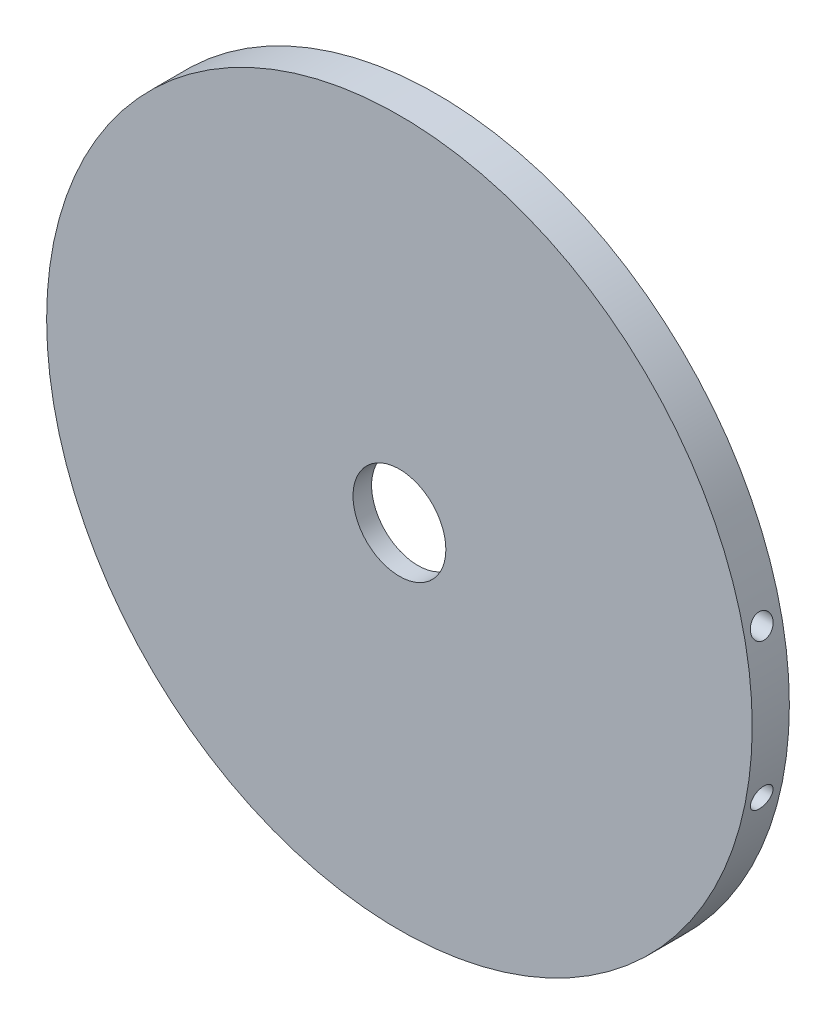
ISO-10303-21;
HEADER;
FILE_DESCRIPTION(('STEP AP214'),'2;1');
FILE_NAME('part.step','',(''),(''),'','','');
FILE_SCHEMA(('AUTOMOTIVE_DESIGN { 1 0 10303 214 1 1 1 1 }'));
ENDSEC;
DATA;
#1=APPLICATION_CONTEXT('core data for automotive mechanical design processes');
#2=APPLICATION_PROTOCOL_DEFINITION('international standard','automotive_design',2000,#1);
#3=PRODUCT_CONTEXT('',#1,'mechanical');
#4=PRODUCT('Part','Part','',(#3));
#5=PRODUCT_RELATED_PRODUCT_CATEGORY('part','',(#4));
#6=PRODUCT_DEFINITION_FORMATION('','',#4);
#7=PRODUCT_DEFINITION_CONTEXT('part definition',#1,'design');
#8=PRODUCT_DEFINITION('design','',#6,#7);
#9=PRODUCT_DEFINITION_SHAPE('','',#8);
#10=(LENGTH_UNIT() NAMED_UNIT(*) SI_UNIT(.MILLI.,.METRE.));
#11=(NAMED_UNIT(*) PLANE_ANGLE_UNIT() SI_UNIT($,.RADIAN.));
#12=(NAMED_UNIT(*) SI_UNIT($,.STERADIAN.) SOLID_ANGLE_UNIT());
#13=UNCERTAINTY_MEASURE_WITH_UNIT(LENGTH_MEASURE(1.E-05),#10,'distance_accuracy_value','');
#14=(GEOMETRIC_REPRESENTATION_CONTEXT(3) GLOBAL_UNCERTAINTY_ASSIGNED_CONTEXT((#13)) GLOBAL_UNIT_ASSIGNED_CONTEXT((#10,
#11,#12)) REPRESENTATION_CONTEXT('',''));
#15=CARTESIAN_POINT('',(0.,0.,0.));
#16=DIRECTION('',(0.,0.,1.));
#17=DIRECTION('',(1.,0.,0.));
#18=AXIS2_PLACEMENT_3D('',#15,#16,#17);
#19=CARTESIAN_POINT('',(0.,0.,2.));
#20=DIRECTION('',(0.,0.,-1.));
#21=DIRECTION('',(-1.,0.,0.));
#22=AXIS2_PLACEMENT_3D('',#19,#20,#21);
#23=CYLINDRICAL_SURFACE('',#22,19.);
#24=CARTESIAN_POINT('',(0.,0.,2.));
#25=DIRECTION('',(0.,0.,1.));
#26=DIRECTION('',(1.,0.,0.));
#27=AXIS2_PLACEMENT_3D('',#24,#25,#26);
#28=CIRCLE('',#27,19.);
#29=CARTESIAN_POINT('',(19.,0.,2.));
#30=VERTEX_POINT('',#29);
#31=EDGE_CURVE('E126',#30,#30,#28,.T.);
#32=ORIENTED_EDGE('',*,*,#31,.F.);
#33=EDGE_LOOP('',(#32));
#34=FACE_BOUND('',#33,.T.);
#35=CARTESIAN_POINT('',(0.,0.,0.));
#36=DIRECTION('',(0.,0.,1.));
#37=DIRECTION('',(1.,0.,0.));
#38=AXIS2_PLACEMENT_3D('',#35,#36,#37);
#39=CIRCLE('',#38,19.);
#40=CARTESIAN_POINT('',(19.,0.,0.));
#41=VERTEX_POINT('',#40);
#42=EDGE_CURVE('E130',#41,#41,#39,.T.);
#43=ORIENTED_EDGE('',*,*,#42,.T.);
#44=EDGE_LOOP('',(#43));
#45=FACE_BOUND('',#44,.T.);
#46=CARTESIAN_POINT('',(-18.5741756210067,-4.,1.66296890370158));
#47=CARTESIAN_POINT('',(-18.5815249929297,-3.96587223415143,1.66296750472297));
#48=CARTESIAN_POINT('',(-18.588784674105,-3.93170040363758,1.66004858263594));
#49=CARTESIAN_POINT('',(-18.6029241651928,-3.86424685247511,1.64841300108457));
#50=CARTESIAN_POINT('',(-18.6098035387069,-3.83096617609546,1.63968982497608));
#51=CARTESIAN_POINT('',(-18.6230037870333,-3.76627402310571,1.61663930523746));
#52=CARTESIAN_POINT('',(-18.6293245563281,-3.73486290000917,1.60231090557083));
#53=CARTESIAN_POINT('',(-18.6412523410298,-3.6748670368708,1.56841456097363));
#54=CARTESIAN_POINT('',(-18.6468595610514,-3.64628148710566,1.54884812310054));
#55=CARTESIAN_POINT('',(-18.6571702034758,-3.59314966512346,1.50527889959143));
#56=CARTESIAN_POINT('',(-18.6618841675241,-3.56855684475595,1.48133540292949));
#57=CARTESIAN_POINT('',(-18.670397438213,-3.52374532813568,1.42951300747107));
#58=CARTESIAN_POINT('',(-18.6741968000893,-3.50352636773855,1.40163434649355));
#59=CARTESIAN_POINT('',(-18.6807447954921,-3.46844167963784,1.34329514816492));
#60=CARTESIAN_POINT('',(-18.6835117052568,-3.4534831383648,1.31289246624025));
#61=CARTESIAN_POINT('',(-18.6880435985092,-3.42887504609031,1.2499398046126));
#62=CARTESIAN_POINT('',(-18.6898086706018,-3.41922502559313,1.21739001508917));
#63=CARTESIAN_POINT('',(-18.6922893619198,-3.40563736744655,1.15155359671798));
#64=CARTESIAN_POINT('',(-18.6930192068163,-3.40162230477446,1.11828346493568));
#65=CARTESIAN_POINT('',(-18.6934634524249,-3.39918017525866,1.05153267559144));
#66=CARTESIAN_POINT('',(-18.6931779007572,-3.4007528463611,1.01805202797578));
#67=CARTESIAN_POINT('',(-18.6916006919173,-3.40941085085573,0.952034539596291));
#68=CARTESIAN_POINT('',(-18.6903148764784,-3.41646417589935,0.919493352849408));
#69=CARTESIAN_POINT('',(-18.6867653110343,-3.43582570836724,0.856071096201153));
#70=CARTESIAN_POINT('',(-18.6845015604176,-3.44813391907788,0.825190027338014));
#71=CARTESIAN_POINT('',(-18.6790257064066,-3.47767507167766,0.765851821419088));
#72=CARTESIAN_POINT('',(-18.6758106464061,-3.49492336156799,0.737402603062132));
#73=CARTESIAN_POINT('',(-18.6684920108411,-3.53380760817148,0.683810810785819));
#74=CARTESIAN_POINT('',(-18.6643883960088,-3.555443758795,0.658668383082653));
#75=CARTESIAN_POINT('',(-18.6553176843425,-3.60273604611925,0.612085876257887));
#76=CARTESIAN_POINT('',(-18.6503412377508,-3.62843537915096,0.590691490171195));
#77=CARTESIAN_POINT('',(-18.6396586851583,-3.68291919779209,0.552511621930139));
#78=CARTESIAN_POINT('',(-18.6339525188732,-3.71170393826371,0.535726520922521));
#79=CARTESIAN_POINT('',(-18.6218282136478,-3.77206531584451,0.506926399866304));
#80=CARTESIAN_POINT('',(-18.6153994246672,-3.80368177982505,0.494999349682272));
#81=CARTESIAN_POINT('',(-18.6020642277437,-3.86837135356215,0.476620107894665));
#82=CARTESIAN_POINT('',(-18.5951577712946,-3.90144461112899,0.470168473194018));
#83=CARTESIAN_POINT('',(-18.5809107825553,-3.96874771435547,0.462810686262643));
#84=CARTESIAN_POINT('',(-18.5735646382168,-4.00298765484551,0.462007585018942));
#85=CARTESIAN_POINT('',(-18.5587577493806,-4.07108406292048,0.466218495520209));
#86=CARTESIAN_POINT('',(-18.5512969952503,-4.10494049785292,0.471232998884909));
#87=CARTESIAN_POINT('',(-18.5363982387496,-4.17170510160814,0.487028760241839));
#88=CARTESIAN_POINT('',(-18.528961413464,-4.20459852541955,0.497873570329955));
#89=CARTESIAN_POINT('',(-18.5144371409456,-4.26810019100853,0.525088297405096));
#90=CARTESIAN_POINT('',(-18.5073496981297,-4.29870840389854,0.541458284221954));
#91=CARTESIAN_POINT('',(-18.4937999148765,-4.35663256680233,0.579229191379506));
#92=CARTESIAN_POINT('',(-18.4873353202231,-4.38396048458227,0.600610927644089));
#93=CARTESIAN_POINT('',(-18.4752484604768,-4.43462218244619,0.647874648969629));
#94=CARTESIAN_POINT('',(-18.4696261097261,-4.45795636873414,0.673756175814743));
#95=CARTESIAN_POINT('',(-18.4595612961218,-4.49944937587113,0.728735199015305));
#96=CARTESIAN_POINT('',(-18.4550971023445,-4.51770406789892,0.757756314206185));
#97=CARTESIAN_POINT('',(-18.4473945741922,-4.54905434207148,0.818612120909295));
#98=CARTESIAN_POINT('',(-18.4441560225864,-4.56215083846263,0.850446312601851));
#99=CARTESIAN_POINT('',(-18.4391246757746,-4.58244346487017,0.915068428286294));
#100=CARTESIAN_POINT('',(-18.4372940452123,-4.58979410106084,0.947804920626908));
#101=CARTESIAN_POINT('',(-18.4350147311652,-4.59894060522575,1.01409082457658));
#102=CARTESIAN_POINT('',(-18.4345658651885,-4.60073720673097,1.04764012824632));
#103=CARTESIAN_POINT('',(-18.435065579914,-4.59873436059197,1.11391176806848));
#104=CARTESIAN_POINT('',(-18.4359874563347,-4.59504185006803,1.14663760139495));
#105=CARTESIAN_POINT('',(-18.4391386928385,-4.58237998205519,1.21098496865067));
#106=CARTESIAN_POINT('',(-18.4413680334268,-4.57341070324506,1.24260651903778));
#107=CARTESIAN_POINT('',(-18.4470408020295,-4.55047517866844,1.30390295412045));
#108=CARTESIAN_POINT('',(-18.4504855702188,-4.53650341672877,1.33357564692084));
#109=CARTESIAN_POINT('',(-18.4584463946566,-4.50400216724039,1.39014818386716));
#110=CARTESIAN_POINT('',(-18.4629625024966,-4.4854724601973,1.4170478943876));
#111=CARTESIAN_POINT('',(-18.4729916985725,-4.44398930341852,1.46790325749323));
#112=CARTESIAN_POINT('',(-18.4785230169688,-4.42095435313137,1.49178879068633));
#113=CARTESIAN_POINT('',(-18.4903150090965,-4.37137269957678,1.53538030879868));
#114=CARTESIAN_POINT('',(-18.4965759574527,-4.34482467351359,1.55508471206419));
#115=CARTESIAN_POINT('',(-18.5097926464648,-4.2881749992538,1.59031975506136));
#116=CARTESIAN_POINT('',(-18.5167628889706,-4.2579949258552,1.60571875012603));
#117=CARTESIAN_POINT('',(-18.5310080338154,-4.19556465931883,1.63120227303043));
#118=CARTESIAN_POINT('',(-18.5382826164532,-4.16331662044267,1.64129223370779));
#119=CARTESIAN_POINT('',(-18.5503624527357,-4.10907972934079,1.65337839317682));
#120=CARTESIAN_POINT('',(-18.5551456386179,-4.08742798778728,1.65696945681186));
#121=CARTESIAN_POINT('',(-18.5646901103176,-4.04385690281115,1.66176518052593));
#122=CARTESIAN_POINT('',(-18.5694513957887,-4.02193755517428,1.66296980297436));
#123=CARTESIAN_POINT('',(-18.5741756210067,-4.,1.66296890370158));
#124=B_SPLINE_CURVE_WITH_KNOTS('',3,(#46,#47,#48,#49,#50,#51,#52,#53,#54,#55,#56,#57,#58,#59,
#60,#61,#62,#63,#64,#65,#66,#67,#68,#69,#70,#71,#72,#73,#74,#75,#76,#77,#78,#79,#80,#81,#82,#83,
#84,#85,#86,#87,#88,#89,#90,#91,#92,#93,#94,#95,#96,#97,#98,#99,#100,#101,#102,#103,#104,#105,
#106,#107,#108,#109,#110,#111,#112,#113,#114,#115,#116,#117,#118,#119,#120,#121,#122,#123),
.UNSPECIFIED.,.T.,.F.,(4,2,2,2,2,2,2,2,2,2,2,2,2,2,2,2,2,2,2,2,2,2,2,2,2,2,2,2,2,2,2,2,2,2,2,2,
2,2,4),(0.,0.104649934266412,0.209417561468992,0.314204936637511,0.418962195342035,
0.52239346529315,0.62581848712014,0.727314443632813,0.828801422205305,0.928879831086661,
1.02895354654714,1.12844716009429,1.22794083586374,1.32774703875376,1.42755765328686,
1.52851121387402,1.62947311990775,1.73218966232275,1.83491665075604,1.93951302453307,
2.04411823792548,2.14988750938438,2.2556581176561,2.36103028282011,2.46639172416368,
2.56960368036979,2.67279733489195,2.77311028154517,2.87340997912771,2.97178110469711,
3.07015076355017,3.16862922911392,3.26711243797811,3.3675770203157,3.46807953929239,
3.57138338258969,3.67458130645379,3.7418499204392,3.80911959514162),.UNSPECIFIED.);
#125=CARTESIAN_POINT('',(-18.5741756210067,-4.,1.66296890370158));
#126=VERTEX_POINT('',#125);
#127=EDGE_CURVE('E105',#126,#126,#124,.T.);
#128=ORIENTED_EDGE('',*,*,#127,.F.);
#129=EDGE_LOOP('',(#128));
#130=FACE_BOUND('',#129,.T.);
#131=CARTESIAN_POINT('',(18.5741756210067,-4.,1.66296890370158));
#132=CARTESIAN_POINT('',(18.5667618434003,-4.03442552835658,1.66296745193903));
#133=CARTESIAN_POINT('',(18.5592461080472,-4.06885583812446,1.65999716823399));
#134=CARTESIAN_POINT('',(18.5442345113438,-4.13673530059586,1.64819792462541));
#135=CARTESIAN_POINT('',(18.5367386879893,-4.17018313436539,1.63936143414421));
#136=CARTESIAN_POINT('',(18.5220111171251,-4.23511655582935,1.61605951231423));
#137=CARTESIAN_POINT('',(18.5147793163661,-4.26660254011487,1.60159522294517));
#138=CARTESIAN_POINT('',(18.5008283765432,-4.32669642616783,1.56741321326701));
#139=CARTESIAN_POINT('',(18.4941090875752,-4.35530517028257,1.54769703671583));
#140=CARTESIAN_POINT('',(18.4814797727218,-4.40858828284578,1.50369572087399));
#141=CARTESIAN_POINT('',(18.4755639190648,-4.43329122419449,1.4794468958969));
#142=CARTESIAN_POINT('',(18.464717913987,-4.47825062310316,1.42693402967633));
#143=CARTESIAN_POINT('',(18.4597876769584,-4.49850746685356,1.39867033751794));
#144=CARTESIAN_POINT('',(18.4512324955913,-4.53346850469408,1.33966138205365));
#145=CARTESIAN_POINT('',(18.4475786702122,-4.54829598256545,1.30899337713155));
#146=CARTESIAN_POINT('',(18.4415751198955,-4.5725774762478,1.24547994749484));
#147=CARTESIAN_POINT('',(18.4392251614172,-4.58203245435553,1.21263491389694));
#148=CARTESIAN_POINT('',(18.435982670829,-4.59506116748671,1.14665120096826));
#149=CARTESIAN_POINT('',(18.4350526221075,-4.59878631586472,1.1135442067426));
#150=CARTESIAN_POINT('',(18.4345726715135,-4.60070990463935,1.04716164707332));
#151=CARTESIAN_POINT('',(18.4350226301668,-4.59890890355121,1.01388609900439));
#152=CARTESIAN_POINT('',(18.4372666147278,-4.58990417879465,0.948578023033201));
#153=CARTESIAN_POINT('',(18.4390425942897,-4.58277299431829,0.916534825296848));
#154=CARTESIAN_POINT('',(18.4438398637098,-4.56342739662545,0.854121876775027));
#155=CARTESIAN_POINT('',(18.446861180336,-4.55121287414472,0.823752161976272));
#156=CARTESIAN_POINT('',(18.4540517484784,-4.52196876277962,0.765267360871491));
#157=CARTESIAN_POINT('',(18.4582300659127,-4.50490111662561,0.737172444361309));
#158=CARTESIAN_POINT('',(18.46755682402,-4.46651251556833,0.684240306521301));
#159=CARTESIAN_POINT('',(18.4727053723145,-4.44519108880564,0.659403447105274));
#160=CARTESIAN_POINT('',(18.4839155226503,-4.39834735975006,0.613045344626338));
#161=CARTESIAN_POINT('',(18.4899961852055,-4.37273597932736,0.59161874758926));
#162=CARTESIAN_POINT('',(18.5027564026133,-4.3184236657677,0.553350994530468));
#163=CARTESIAN_POINT('',(18.509436041539,-4.28972229880261,0.536510483560871));
#164=CARTESIAN_POINT('',(18.523355793683,-4.22921715845071,0.507437213552587));
#165=CARTESIAN_POINT('',(18.5306060680238,-4.19735133195943,0.495338368342811));
#166=CARTESIAN_POINT('',(18.5452723796847,-4.13206865569654,0.476700625564595));
#167=CARTESIAN_POINT('',(18.5526884335896,-4.09865165038082,0.470162286850294));
#168=CARTESIAN_POINT('',(18.5675801981723,-4.03065686688361,0.462762705626421));
#169=CARTESIAN_POINT('',(18.5750550564971,-3.99606912861515,0.461990867329341));
#170=CARTESIAN_POINT('',(18.5897341592058,-3.92721570486054,0.466401624343716));
#171=CARTESIAN_POINT('',(18.5969383996791,-3.89295002403368,0.471584305667366));
#172=CARTESIAN_POINT('',(18.6108745385593,-3.82577113646621,0.487784936876938));
#173=CARTESIAN_POINT('',(18.6176070114819,-3.79285630565492,0.498795644492518));
#174=CARTESIAN_POINT('',(18.6304396709163,-3.72931215470678,0.526380145141936));
#175=CARTESIAN_POINT('',(18.6365399000003,-3.69868268072422,0.542953563291339));
#176=CARTESIAN_POINT('',(18.6478815163428,-3.64106661909254,0.580951679791265));
#177=CARTESIAN_POINT('',(18.6531339756718,-3.61403404770133,0.602303319321051));
#178=CARTESIAN_POINT('',(18.6627701544526,-3.56393913085968,0.649408027199268));
#179=CARTESIAN_POINT('',(18.667153963536,-3.54087637581649,0.675160640922441));
#180=CARTESIAN_POINT('',(18.6748892339993,-3.49984872422522,0.729811087570151));
#181=CARTESIAN_POINT('',(18.6782586786558,-3.48179553185158,0.758640096812681));
#182=CARTESIAN_POINT('',(18.6840124828778,-3.45078650182176,0.819010481830996));
#183=CARTESIAN_POINT('',(18.6863969358169,-3.4378301810068,0.850551600166363));
#184=CARTESIAN_POINT('',(18.6901089132635,-3.41759179850247,0.914912298573875));
#185=CARTESIAN_POINT('',(18.6914525602261,-3.4102232200982,0.947703762733593));
#186=CARTESIAN_POINT('',(18.6931225583801,-3.40105736459553,1.01408121437412));
#187=CARTESIAN_POINT('',(18.6934489675539,-3.39925976995088,1.04766715645969));
#188=CARTESIAN_POINT('',(18.6930808246809,-3.40128359790597,1.11437972137658));
#189=CARTESIAN_POINT('',(18.6923948293693,-3.40505792727759,1.14750783228358));
#190=CARTESIAN_POINT('',(18.6900286191527,-3.418021811164,1.21264931235258));
#191=CARTESIAN_POINT('',(18.6883484153954,-3.42721130496065,1.24466269400934));
#192=CARTESIAN_POINT('',(18.6840205672529,-3.45072709429098,1.30668992792135));
#193=CARTESIAN_POINT('',(18.6813724615487,-3.46505583922108,1.33670281862904));
#194=CARTESIAN_POINT('',(18.6751546345061,-3.49841192646051,1.39388441382787));
#195=CARTESIAN_POINT('',(18.6715849212831,-3.51743922739644,1.42105314336044));
#196=CARTESIAN_POINT('',(18.6635522444106,-3.55981538389666,1.47204894657705));
#197=CARTESIAN_POINT('',(18.6590815284999,-3.58320160258069,1.49584373473713));
#198=CARTESIAN_POINT('',(18.649352767824,-3.6334964204897,1.5391804343899));
#199=CARTESIAN_POINT('',(18.6440944744389,-3.66040613166036,1.55872099812682));
#200=CARTESIAN_POINT('',(18.6328079721929,-3.7174352998656,1.59333523575686));
#201=CARTESIAN_POINT('',(18.6267685151047,-3.74760029884606,1.60833009000303));
#202=CARTESIAN_POINT('',(18.6141291470338,-3.80988217390208,1.63303509794223));
#203=CARTESIAN_POINT('',(18.6075298402208,-3.84199693548097,1.64275086682952));
#204=CARTESIAN_POINT('',(18.5964372563031,-3.89524934394441,1.65413114483648));
#205=CARTESIAN_POINT('',(18.5920632651537,-3.91607469683903,1.65744296520536));
#206=CARTESIAN_POINT('',(18.5831974118909,-3.95793277037829,1.66186229679177));
#207=CARTESIAN_POINT('',(18.5787055488548,-3.97896549264528,1.66296979074999));
#208=CARTESIAN_POINT('',(18.5741756210067,-4.,1.66296890370158));
#209=B_SPLINE_CURVE_WITH_KNOTS('',3,(#131,#132,#133,#134,#135,#136,#137,#138,#139,#140,#141,
#142,#143,#144,#145,#146,#147,#148,#149,#150,#151,#152,#153,#154,#155,#156,#157,#158,#159,#160,
#161,#162,#163,#164,#165,#166,#167,#168,#169,#170,#171,#172,#173,#174,#175,#176,#177,#178,#179,
#180,#181,#182,#183,#184,#185,#186,#187,#188,#189,#190,#191,#192,#193,#194,#195,#196,#197,#198,
#199,#200,#201,#202,#203,#204,#205,#206,#207,#208),.UNSPECIFIED.,.T.,.F.,(4,2,2,2,2,2,2,2,2,2,2,
2,2,2,2,2,2,2,2,2,2,2,2,2,2,2,2,2,2,2,2,2,2,2,2,2,2,2,4),(0.,0.10556611920433,0.211268018671621,
0.316948480534483,0.422597912529912,0.527434617368161,0.632262212426792,0.734535246575268,
0.836789956282117,0.936293069642895,1.03578612678371,1.13394927478774,1.23211453287694,
1.33107188157085,1.43004021342315,1.53140056955641,1.63277517509124,1.73683587875284,
1.84090703971446,1.94658844303414,2.05227137292598,2.15782328185496,2.26336807881482,
2.36739771136396,2.47141660403144,2.57346499619834,2.67550371233849,2.77592832048874,
2.87634720432807,2.97592220440871,3.07549608801477,3.1751174923026,3.27473801939998,
3.37525539010522,3.47580455893693,3.57800877660916,3.68010406904393,3.7446060253201,
3.80910848662766),.UNSPECIFIED.);
#210=CARTESIAN_POINT('',(18.5741756210067,-4.,1.66296890370158));
#211=VERTEX_POINT('',#210);
#212=EDGE_CURVE('E152',#211,#211,#209,.T.);
#213=ORIENTED_EDGE('',*,*,#212,.F.);
#214=EDGE_LOOP('',(#213));
#215=FACE_BOUND('',#214,.T.);
#216=CARTESIAN_POINT('',(-18.5741756210067,4.,1.66296890370158));
#217=CARTESIAN_POINT('',(-18.5667618434003,4.03442552835658,1.66296745193903));
#218=CARTESIAN_POINT('',(-18.5592461080472,4.06885583812446,1.65999716823399));
#219=CARTESIAN_POINT('',(-18.5442345113438,4.13673530059587,1.64819792462541));
#220=CARTESIAN_POINT('',(-18.5367386879893,4.17018313436539,1.63936143414422));
#221=CARTESIAN_POINT('',(-18.5220111171251,4.23511655582935,1.61605951231423));
#222=CARTESIAN_POINT('',(-18.5147793163661,4.26660254011487,1.60159522294517));
#223=CARTESIAN_POINT('',(-18.5008283765432,4.32669642616783,1.56741321326701));
#224=CARTESIAN_POINT('',(-18.4941090875752,4.35530517028256,1.54769703671583));
#225=CARTESIAN_POINT('',(-18.4814797727218,4.40858828284578,1.503695720874));
#226=CARTESIAN_POINT('',(-18.4755639190648,4.43329122419449,1.4794468958969));
#227=CARTESIAN_POINT('',(-18.464717913987,4.47825062310316,1.42693402967633));
#228=CARTESIAN_POINT('',(-18.4597876769584,4.49850746685356,1.39867033751794));
#229=CARTESIAN_POINT('',(-18.4512324955913,4.53346850469408,1.33966138205365));
#230=CARTESIAN_POINT('',(-18.4475786702122,4.54829598256545,1.30899337713155));
#231=CARTESIAN_POINT('',(-18.4415751198955,4.5725774762478,1.24547994749485));
#232=CARTESIAN_POINT('',(-18.4392251614172,4.58203245435553,1.21263491389695));
#233=CARTESIAN_POINT('',(-18.435982670829,4.59506116748671,1.14665120096826));
#234=CARTESIAN_POINT('',(-18.4350526221075,4.59878631586472,1.11354420674261));
#235=CARTESIAN_POINT('',(-18.4345726715135,4.60070990463935,1.04716164707332));
#236=CARTESIAN_POINT('',(-18.4350226301668,4.59890890355121,1.01388609900439));
#237=CARTESIAN_POINT('',(-18.4372666147278,4.58990417879466,0.948578023033208));
#238=CARTESIAN_POINT('',(-18.4390425942897,4.58277299431829,0.916534825296855));
#239=CARTESIAN_POINT('',(-18.4438398637098,4.56342739662545,0.854121876775035));
#240=CARTESIAN_POINT('',(-18.446861180336,4.55121287414473,0.82375216197628));
#241=CARTESIAN_POINT('',(-18.4540517484784,4.52196876277962,0.765267360871499));
#242=CARTESIAN_POINT('',(-18.4582300659127,4.50490111662561,0.737172444361317));
#243=CARTESIAN_POINT('',(-18.46755682402,4.46651251556834,0.684240306521309));
#244=CARTESIAN_POINT('',(-18.4727053723145,4.44519108880565,0.659403447105282));
#245=CARTESIAN_POINT('',(-18.4839155226503,4.39834735975007,0.613045344626346));
#246=CARTESIAN_POINT('',(-18.4899961852055,4.37273597932737,0.591618747589267));
#247=CARTESIAN_POINT('',(-18.5027564026133,4.31842366576771,0.553350994530475));
#248=CARTESIAN_POINT('',(-18.509436041539,4.28972229880262,0.536510483560878));
#249=CARTESIAN_POINT('',(-18.523355793683,4.22921715845072,0.507437213552592));
#250=CARTESIAN_POINT('',(-18.5306060680238,4.19735133195944,0.495338368342816));
#251=CARTESIAN_POINT('',(-18.5452723796847,4.13206865569655,0.476700625564599));
#252=CARTESIAN_POINT('',(-18.5526884335896,4.09865165038083,0.470162286850297));
#253=CARTESIAN_POINT('',(-18.5675801981723,4.03065686688362,0.462762705626422));
#254=CARTESIAN_POINT('',(-18.5750550564971,3.99606912861516,0.461990867329342));
#255=CARTESIAN_POINT('',(-18.5897341592058,3.92721570486056,0.466401624343716));
#256=CARTESIAN_POINT('',(-18.5969383996791,3.8929500240337,0.471584305667365));
#257=CARTESIAN_POINT('',(-18.6108745385593,3.82577113646622,0.487784936876936));
#258=CARTESIAN_POINT('',(-18.6176070114819,3.79285630565493,0.498795644492514));
#259=CARTESIAN_POINT('',(-18.6304396709163,3.72931215470679,0.526380145141931));
#260=CARTESIAN_POINT('',(-18.6365399000003,3.69868268072423,0.542953563291333));
#261=CARTESIAN_POINT('',(-18.6478815163428,3.64106661909255,0.580951679791258));
#262=CARTESIAN_POINT('',(-18.6531339756718,3.61403404770134,0.602303319321044));
#263=CARTESIAN_POINT('',(-18.6627701544526,3.56393913085969,0.649408027199261));
#264=CARTESIAN_POINT('',(-18.667153963536,3.54087637581649,0.675160640922433));
#265=CARTESIAN_POINT('',(-18.6748892339993,3.49984872422522,0.729811087570143));
#266=CARTESIAN_POINT('',(-18.6782586786558,3.48179553185159,0.758640096812673));
#267=CARTESIAN_POINT('',(-18.6840124828778,3.45078650182177,0.819010481830987));
#268=CARTESIAN_POINT('',(-18.6863969358169,3.4378301810068,0.850551600166355));
#269=CARTESIAN_POINT('',(-18.6901089132635,3.41759179850247,0.914912298573867));
#270=CARTESIAN_POINT('',(-18.6914525602261,3.41022322009821,0.947703762733584));
#271=CARTESIAN_POINT('',(-18.6931225583801,3.40105736459553,1.01408121437411));
#272=CARTESIAN_POINT('',(-18.6934489675539,3.39925976995088,1.04766715645969));
#273=CARTESIAN_POINT('',(-18.6930808246809,3.40128359790597,1.11437972137657));
#274=CARTESIAN_POINT('',(-18.6923948293693,3.40505792727759,1.14750783228358));
#275=CARTESIAN_POINT('',(-18.6900286191527,3.418021811164,1.21264931235258));
#276=CARTESIAN_POINT('',(-18.6883484153954,3.42721130496065,1.24466269400933));
#277=CARTESIAN_POINT('',(-18.6840205672529,3.45072709429098,1.30668992792134));
#278=CARTESIAN_POINT('',(-18.6813724615487,3.46505583922108,1.33670281862903));
#279=CARTESIAN_POINT('',(-18.6751546345061,3.4984119264605,1.39388441382787));
#280=CARTESIAN_POINT('',(-18.6715849212831,3.51743922739643,1.42105314336043));
#281=CARTESIAN_POINT('',(-18.6635522444106,3.55981538389665,1.47204894657705));
#282=CARTESIAN_POINT('',(-18.6590815284999,3.58320160258069,1.49584373473713));
#283=CARTESIAN_POINT('',(-18.649352767824,3.6334964204897,1.53918043438989));
#284=CARTESIAN_POINT('',(-18.6440944744389,3.66040613166036,1.55872099812682));
#285=CARTESIAN_POINT('',(-18.6328079721929,3.7174352998656,1.59333523575685));
#286=CARTESIAN_POINT('',(-18.6267685151047,3.74760029884606,1.60833009000303));
#287=CARTESIAN_POINT('',(-18.6141291470338,3.80988217390207,1.63303509794223));
#288=CARTESIAN_POINT('',(-18.6075298402208,3.84199693548097,1.64275086682952));
#289=CARTESIAN_POINT('',(-18.5964372563031,3.89524934394441,1.65413114483648));
#290=CARTESIAN_POINT('',(-18.5920632651537,3.91607469683903,1.65744296520536));
#291=CARTESIAN_POINT('',(-18.5831974118909,3.95793277037829,1.66186229679177));
#292=CARTESIAN_POINT('',(-18.5787055488548,3.97896549264528,1.66296979074999));
#293=CARTESIAN_POINT('',(-18.5741756210067,4.,1.66296890370158));
#294=B_SPLINE_CURVE_WITH_KNOTS('',3,(#216,#217,#218,#219,#220,#221,#222,#223,#224,#225,#226,
#227,#228,#229,#230,#231,#232,#233,#234,#235,#236,#237,#238,#239,#240,#241,#242,#243,#244,#245,
#246,#247,#248,#249,#250,#251,#252,#253,#254,#255,#256,#257,#258,#259,#260,#261,#262,#263,#264,
#265,#266,#267,#268,#269,#270,#271,#272,#273,#274,#275,#276,#277,#278,#279,#280,#281,#282,#283,
#284,#285,#286,#287,#288,#289,#290,#291,#292,#293),.UNSPECIFIED.,.T.,.F.,(4,2,2,2,2,2,2,2,2,2,2,
2,2,2,2,2,2,2,2,2,2,2,2,2,2,2,2,2,2,2,2,2,2,2,2,2,2,2,4),(0.,0.105566119204328,
0.211268018671618,0.316948480534478,0.422597912529906,0.527434617368155,0.632262212426786,
0.73453524657526,0.83678995628211,0.936293069642886,1.0357861267837,1.13394927478773,
1.23211453287693,1.33107188157083,1.43004021342314,1.53140056955639,1.63277517509122,
1.73683587875283,1.84090703971444,1.94658844303413,2.05227137292596,2.15782328185494,
2.2633680788148,2.36739771136394,2.47141660403142,2.57346499619833,2.67550371233847,
2.77592832048872,2.87634720432806,2.9759222044087,3.07549608801477,3.17511749230259,
3.27473801939997,3.37525539010521,3.47580455893692,3.57800877660915,3.68010406904393,
3.74460602532009,3.80910848662766),.UNSPECIFIED.);
#295=CARTESIAN_POINT('',(-18.5741756210067,4.,1.66296890370158));
#296=VERTEX_POINT('',#295);
#297=EDGE_CURVE('E201',#296,#296,#294,.T.);
#298=ORIENTED_EDGE('',*,*,#297,.F.);
#299=EDGE_LOOP('',(#298));
#300=FACE_BOUND('',#299,.T.);
#301=CARTESIAN_POINT('',(18.5741756210067,4.,1.66296890370158));
#302=CARTESIAN_POINT('',(18.5815249929297,3.96587223415143,1.66296750472297));
#303=CARTESIAN_POINT('',(18.588784674105,3.93170040363758,1.66004858263594));
#304=CARTESIAN_POINT('',(18.6029241651927,3.86424685247511,1.64841300108457));
#305=CARTESIAN_POINT('',(18.6098035387069,3.83096617609546,1.63968982497609));
#306=CARTESIAN_POINT('',(18.6230037870333,3.76627402310571,1.61663930523746));
#307=CARTESIAN_POINT('',(18.6293245563281,3.73486290000917,1.60231090557083));
#308=CARTESIAN_POINT('',(18.6412523410298,3.6748670368708,1.56841456097363));
#309=CARTESIAN_POINT('',(18.6468595610514,3.64628148710566,1.54884812310054));
#310=CARTESIAN_POINT('',(18.6571702034758,3.59314966512347,1.50527889959143));
#311=CARTESIAN_POINT('',(18.6618841675241,3.56855684475595,1.48133540292949));
#312=CARTESIAN_POINT('',(18.670397438213,3.52374532813568,1.42951300747107));
#313=CARTESIAN_POINT('',(18.6741968000893,3.50352636773855,1.40163434649355));
#314=CARTESIAN_POINT('',(18.6807447954921,3.46844167963784,1.34329514816492));
#315=CARTESIAN_POINT('',(18.6835117052568,3.45348313836481,1.31289246624025));
#316=CARTESIAN_POINT('',(18.6880435985092,3.42887504609031,1.2499398046126));
#317=CARTESIAN_POINT('',(18.6898086706018,3.41922502559313,1.21739001508917));
#318=CARTESIAN_POINT('',(18.6922893619198,3.40563736744656,1.15155359671798));
#319=CARTESIAN_POINT('',(18.6930192068163,3.40162230477446,1.11828346493569));
#320=CARTESIAN_POINT('',(18.6934634524249,3.39918017525866,1.05153267559145));
#321=CARTESIAN_POINT('',(18.6931779007572,3.4007528463611,1.01805202797579));
#322=CARTESIAN_POINT('',(18.6916006919173,3.40941085085573,0.952034539596299));
#323=CARTESIAN_POINT('',(18.6903148764784,3.41646417589935,0.919493352849415));
#324=CARTESIAN_POINT('',(18.6867653110343,3.43582570836724,0.85607109620116));
#325=CARTESIAN_POINT('',(18.6845015604176,3.44813391907787,0.825190027338022));
#326=CARTESIAN_POINT('',(18.6790257064066,3.47767507167766,0.765851821419096));
#327=CARTESIAN_POINT('',(18.6758106464061,3.49492336156799,0.73740260306214));
#328=CARTESIAN_POINT('',(18.6684920108411,3.53380760817147,0.683810810785827));
#329=CARTESIAN_POINT('',(18.6643883960088,3.55544375879499,0.65866838308266));
#330=CARTESIAN_POINT('',(18.6553176843425,3.60273604611924,0.612085876257894));
#331=CARTESIAN_POINT('',(18.6503412377508,3.62843537915095,0.590691490171202));
#332=CARTESIAN_POINT('',(18.6396586851583,3.68291919779208,0.552511621930144));
#333=CARTESIAN_POINT('',(18.6339525188732,3.7117039382637,0.535726520922526));
#334=CARTESIAN_POINT('',(18.6218282136478,3.7720653158445,0.506926399866309));
#335=CARTESIAN_POINT('',(18.6153994246672,3.80368177982504,0.494999349682277));
#336=CARTESIAN_POINT('',(18.6020642277437,3.86837135356213,0.476620107894668));
#337=CARTESIAN_POINT('',(18.5951577712946,3.90144461112898,0.470168473194021));
#338=CARTESIAN_POINT('',(18.5809107825553,3.96874771435546,0.462810686262644));
#339=CARTESIAN_POINT('',(18.5735646382168,4.0029876548455,0.462007585018943));
#340=CARTESIAN_POINT('',(18.5587577493806,4.07108406292047,0.466218495520208));
#341=CARTESIAN_POINT('',(18.5512969952503,4.10494049785291,0.471232998884908));
#342=CARTESIAN_POINT('',(18.5363982387496,4.17170510160813,0.487028760241837));
#343=CARTESIAN_POINT('',(18.528961413464,4.20459852541954,0.497873570329952));
#344=CARTESIAN_POINT('',(18.5144371409456,4.26810019100852,0.525088297405091));
#345=CARTESIAN_POINT('',(18.5073496981297,4.29870840389852,0.541458284221949));
#346=CARTESIAN_POINT('',(18.4937999148765,4.35663256680232,0.579229191379499));
#347=CARTESIAN_POINT('',(18.4873353202231,4.38396048458225,0.600610927644081));
#348=CARTESIAN_POINT('',(18.4752484604768,4.43462218244618,0.647874648969621));
#349=CARTESIAN_POINT('',(18.4696261097261,4.45795636873413,0.673756175814735));
#350=CARTESIAN_POINT('',(18.4595612961218,4.49944937587113,0.728735199015297));
#351=CARTESIAN_POINT('',(18.4550971023445,4.51770406789892,0.757756314206177));
#352=CARTESIAN_POINT('',(18.4473945741922,4.54905434207148,0.818612120909285));
#353=CARTESIAN_POINT('',(18.4441560225864,4.56215083846263,0.850446312601841));
#354=CARTESIAN_POINT('',(18.4391246757746,4.58244346487017,0.915068428286284));
#355=CARTESIAN_POINT('',(18.4372940452123,4.58979410106083,0.947804920626898));
#356=CARTESIAN_POINT('',(18.4350147311652,4.59894060522574,1.01409082457657));
#357=CARTESIAN_POINT('',(18.4345658651885,4.60073720673097,1.04764012824631));
#358=CARTESIAN_POINT('',(18.435065579914,4.59873436059197,1.11391176806847));
#359=CARTESIAN_POINT('',(18.4359874563347,4.59504185006803,1.14663760139494));
#360=CARTESIAN_POINT('',(18.4391386928385,4.5823799820552,1.21098496865066));
#361=CARTESIAN_POINT('',(18.4413680334268,4.57341070324506,1.24260651903777));
#362=CARTESIAN_POINT('',(18.4470408020295,4.55047517866845,1.30390295412044));
#363=CARTESIAN_POINT('',(18.4504855702188,4.53650341672877,1.33357564692083));
#364=CARTESIAN_POINT('',(18.4584463946566,4.50400216724039,1.39014818386716));
#365=CARTESIAN_POINT('',(18.4629625024966,4.48547246019731,1.41704789438759));
#366=CARTESIAN_POINT('',(18.4729916985725,4.44398930341852,1.46790325749323));
#367=CARTESIAN_POINT('',(18.4785230169688,4.42095435313137,1.49178879068633));
#368=CARTESIAN_POINT('',(18.4903150090965,4.37137269957678,1.53538030879868));
#369=CARTESIAN_POINT('',(18.4965759574527,4.34482467351359,1.55508471206419));
#370=CARTESIAN_POINT('',(18.5097926464648,4.2881749992538,1.59031975506136));
#371=CARTESIAN_POINT('',(18.5167628889705,4.2579949258552,1.60571875012603));
#372=CARTESIAN_POINT('',(18.5310080338154,4.19556465931883,1.63120227303043));
#373=CARTESIAN_POINT('',(18.5382826164532,4.16331662044267,1.64129223370779));
#374=CARTESIAN_POINT('',(18.5503624527357,4.10907972934079,1.65337839317682));
#375=CARTESIAN_POINT('',(18.5551456386179,4.08742798778728,1.65696945681186));
#376=CARTESIAN_POINT('',(18.5646901103176,4.04385690281115,1.66176518052593));
#377=CARTESIAN_POINT('',(18.5694513957887,4.02193755517428,1.66296980297436));
#378=CARTESIAN_POINT('',(18.5741756210067,4.,1.66296890370158));
#379=B_SPLINE_CURVE_WITH_KNOTS('',3,(#301,#302,#303,#304,#305,#306,#307,#308,#309,#310,#311,
#312,#313,#314,#315,#316,#317,#318,#319,#320,#321,#322,#323,#324,#325,#326,#327,#328,#329,#330,
#331,#332,#333,#334,#335,#336,#337,#338,#339,#340,#341,#342,#343,#344,#345,#346,#347,#348,#349,
#350,#351,#352,#353,#354,#355,#356,#357,#358,#359,#360,#361,#362,#363,#364,#365,#366,#367,#368,
#369,#370,#371,#372,#373,#374,#375,#376,#377,#378),.UNSPECIFIED.,.T.,.F.,(4,2,2,2,2,2,2,2,2,2,2,
2,2,2,2,2,2,2,2,2,2,2,2,2,2,2,2,2,2,2,2,2,2,2,2,2,2,2,4),(0.,0.104649934266409,
0.209417561468989,0.314204936637506,0.418962195342029,0.522393465293144,0.625818487120134,
0.727314443632806,0.828801422205296,0.928879831086652,1.02895354654713,1.12844716009428,
1.22794083586373,1.32774703875375,1.42755765328685,1.52851121387401,1.62947311990774,
1.73218966232273,1.83491665075602,1.93951302453306,2.04411823792546,2.14988750938436,
2.25565811765608,2.3610302828201,2.46639172416367,2.56960368036978,2.67279733489193,
2.77311028154515,2.8734099791277,2.9717811046971,3.07015076355016,3.16862922911391,
3.2671124379781,3.36757702031569,3.46807953929238,3.57138338258968,3.67458130645378,
3.7418499204392,3.80911959514162),.UNSPECIFIED.);
#380=CARTESIAN_POINT('',(18.5741756210067,4.,1.66296890370158));
#381=VERTEX_POINT('',#380);
#382=EDGE_CURVE('E117',#381,#381,#379,.T.);
#383=ORIENTED_EDGE('',*,*,#382,.F.);
#384=EDGE_LOOP('',(#383));
#385=FACE_BOUND('',#384,.T.);
#386=ADVANCED_FACE('F45',(#34,#45,#130,#215,#300,#385),#23,.T.);
#387=CARTESIAN_POINT('',(0.,0.,1.));
#388=DIRECTION('',(0.,0.,-1.));
#389=DIRECTION('',(-1.,0.,0.));
#390=AXIS2_PLACEMENT_3D('',#387,#388,#389);
#391=CYLINDRICAL_SURFACE('',#390,12.);
#392=CARTESIAN_POINT('',(0.,0.,0.));
#393=DIRECTION('',(0.,0.,1.));
#394=DIRECTION('',(1.,0.,0.));
#395=AXIS2_PLACEMENT_3D('',#392,#393,#394);
#396=CIRCLE('',#395,12.);
#397=CARTESIAN_POINT('',(12.,0.,0.));
#398=VERTEX_POINT('',#397);
#399=EDGE_CURVE('E114',#398,#398,#396,.T.);
#400=ORIENTED_EDGE('',*,*,#399,.F.);
#401=EDGE_LOOP('',(#400));
#402=FACE_BOUND('',#401,.T.);
#403=CARTESIAN_POINT('',(0.,0.,1.));
#404=DIRECTION('',(0.,0.,1.));
#405=DIRECTION('',(1.,0.,0.));
#406=AXIS2_PLACEMENT_3D('',#403,#404,#405);
#407=CIRCLE('',#406,12.);
#408=CARTESIAN_POINT('',(11.5072784796044,-3.40331338445829,1.));
#409=VERTEX_POINT('',#408);
#410=CARTESIAN_POINT('',(11.5072784796044,3.40331338445829,1.));
#411=VERTEX_POINT('',#410);
#412=EDGE_CURVE('E109',#409,#411,#407,.T.);
#413=ORIENTED_EDGE('',*,*,#412,.T.);
#414=CARTESIAN_POINT('',(11.5072784796044,3.40331338445829,1.));
#415=CARTESIAN_POINT('',(11.5062630892122,3.40673480785669,0.967266117192075));
#416=CARTESIAN_POINT('',(11.5044393100852,3.41290762979571,0.934867222142468));
#417=CARTESIAN_POINT('',(11.4992440018661,3.43037769237398,0.871678660563986));
#418=CARTESIAN_POINT('',(11.4958755613297,3.44166470663409,0.840885918725268));
#419=CARTESIAN_POINT('',(11.487655541215,3.46900082273781,0.781712628443678));
#420=CARTESIAN_POINT('',(11.4828040122502,3.48504976207044,0.75333199772482));
#421=CARTESIAN_POINT('',(11.4717201621661,3.52136301108673,0.699713230911987));
#422=CARTESIAN_POINT('',(11.4654876357535,3.54162794747527,0.674475562909763));
#423=CARTESIAN_POINT('',(11.4516319596826,3.5861788393477,0.627278147885961));
#424=CARTESIAN_POINT('',(11.4439833217103,3.61053758416326,0.605394689745945));
#425=CARTESIAN_POINT('',(11.4275457077269,3.66223079214225,0.566009636943035));
#426=CARTESIAN_POINT('',(11.4187564272541,3.68956604948497,0.54850921587238));
#427=CARTESIAN_POINT('',(11.3998217146525,3.74767087913237,0.517570269046519));
#428=CARTESIAN_POINT('',(11.3896339859918,3.77853800360068,0.504340942668187));
#429=CARTESIAN_POINT('',(11.3684553224101,3.84178817256089,0.48324376144635));
#430=CARTESIAN_POINT('',(11.3574642355281,3.87417150343598,0.475376923878791));
#431=CARTESIAN_POINT('',(11.3343979143406,3.94115924712032,0.464854465176008));
#432=CARTESIAN_POINT('',(11.3222959845423,3.9757961564836,0.462463706947654));
#433=CARTESIAN_POINT('',(11.2978045432965,4.04486791271699,0.463652031754293));
#434=CARTESIAN_POINT('',(11.285414966358,4.07930271129011,0.467232487713886));
#435=CARTESIAN_POINT('',(11.2602796852474,4.14819107840144,0.480466015815447));
#436=CARTESIAN_POINT('',(11.2475357312001,4.18260771767313,0.490315712476481));
#437=CARTESIAN_POINT('',(11.2225100659992,4.24929846492392,0.516043134133887));
#438=CARTESIAN_POINT('',(11.2102284050782,4.2815723403604,0.531921512138352));
#439=CARTESIAN_POINT('',(11.1866076163101,4.34291235356814,0.569312006020531));
#440=CARTESIAN_POINT('',(11.1752656276541,4.37198832303492,0.590806127286543));
#441=CARTESIAN_POINT('',(11.1539526861156,4.42608018635744,0.638980657861783));
#442=CARTESIAN_POINT('',(11.14398153648,4.4510966629551,0.665660321573592));
#443=CARTESIAN_POINT('',(11.1263418309371,4.49500295124292,0.722104990500739));
#444=CARTESIAN_POINT('',(11.1185846519937,4.51413217492064,0.751655885802726));
#445=CARTESIAN_POINT('',(11.1051660520039,4.54704350407706,0.81400860336023));
#446=CARTESIAN_POINT('',(11.0995013283568,4.56083403747776,0.846805198154064));
#447=CARTESIAN_POINT('',(11.0925090546911,4.57780374899574,0.900008880593568));
#448=CARTESIAN_POINT('',(11.0903635866157,4.58299673609564,0.919689505770581));
#449=CARTESIAN_POINT('',(11.08690047154,4.59136748901234,0.95953254124486));
#450=CARTESIAN_POINT('',(11.0855823116222,4.59454650347066,0.979694644967597));
#451=CARTESIAN_POINT('',(11.0846954021525,4.59668661554171,1.));
#452=B_SPLINE_CURVE_WITH_KNOTS('',3,(#414,#415,#416,#417,#418,#419,#420,#421,#422,#423,#424,
#425,#426,#427,#428,#429,#430,#431,#432,#433,#434,#435,#436,#437,#438,#439,#440,#441,#442,#443,
#444,#445,#446,#447,#448,#449,#450,#451),.UNSPECIFIED.,.F.,.F.,(4,2,2,2,2,2,2,2,2,2,2,2,2,2,2,2,
2,2,4),(0.,0.0986310484215247,0.197065737904162,0.295497068476829,0.393943041263168,
0.49437251044626,0.594828841720492,0.699644078238048,0.804479192907592,0.914286595450901,
1.02411924881672,1.137578775447,1.25105059516948,1.36416318211177,1.47725951730269,
1.58483656786318,1.69224309258887,1.75353376503892,1.81478640064287),.UNSPECIFIED.);
#453=CARTESIAN_POINT('',(11.0846954021525,4.59668661554171,1.));
#454=VERTEX_POINT('',#453);
#455=EDGE_CURVE('E68',#411,#454,#452,.T.);
#456=ORIENTED_EDGE('',*,*,#455,.T.);
#457=CARTESIAN_POINT('',(-11.0846954021525,4.59668661554171,1.));
#458=VERTEX_POINT('',#457);
#459=EDGE_CURVE('E113',#454,#458,#407,.T.);
#460=ORIENTED_EDGE('',*,*,#459,.T.);
#461=CARTESIAN_POINT('',(-11.0846954021525,4.59668661554171,1.));
#462=CARTESIAN_POINT('',(-11.0860904947716,4.59331413823614,0.967718140736702));
#463=CARTESIAN_POINT('',(-11.0886001800561,4.58726624098065,0.935802574536613));
#464=CARTESIAN_POINT('',(-11.0956269649252,4.57024793327002,0.873652968848505));
#465=CARTESIAN_POINT('',(-11.1001373905781,4.55929388723894,0.843413711801361));
#466=CARTESIAN_POINT('',(-11.1109518042307,4.53287399456674,0.785362841043924));
#467=CARTESIAN_POINT('',(-11.1172544245208,4.5174115882442,0.757549397149127));
#468=CARTESIAN_POINT('',(-11.1313707014987,4.48251507935156,0.704952912641576));
#469=CARTESIAN_POINT('',(-11.1391852802154,4.4630785528536,0.680171736309606));
#470=CARTESIAN_POINT('',(-11.1563831719421,4.41991802513664,0.633166003089778));
#471=CARTESIAN_POINT('',(-11.1658195702717,4.39604537043365,0.611097614233127));
#472=CARTESIAN_POINT('',(-11.1856583196584,4.34531814655854,0.571240629744015));
#473=CARTESIAN_POINT('',(-11.1960609519486,4.3184627087662,0.553453285601237));
#474=CARTESIAN_POINT('',(-11.2182584197005,4.26048194129007,0.521376479391745));
#475=CARTESIAN_POINT('',(-11.2300997081565,4.2291891043479,0.507421507706723));
#476=CARTESIAN_POINT('',(-11.2541339698535,4.16481089046666,0.485041992792785));
#477=CARTESIAN_POINT('',(-11.26632702988,4.13172506938129,0.476618826708116));
#478=CARTESIAN_POINT('',(-11.2912662504652,4.06308962251862,0.465237253823894));
#479=CARTESIAN_POINT('',(-11.3040126087802,4.02749612509321,0.462541827490582));
#480=CARTESIAN_POINT('',(-11.3291405132512,3.95626112038518,0.463505912884602));
#481=CARTESIAN_POINT('',(-11.3415220304919,3.92061960953013,0.467165926939707));
#482=CARTESIAN_POINT('',(-11.3656051829463,3.85024737679289,0.480850802184553));
#483=CARTESIAN_POINT('',(-11.3773053192972,3.81551874867564,0.490889156573478));
#484=CARTESIAN_POINT('',(-11.3996789026559,3.74814370764505,0.517189291065283));
#485=CARTESIAN_POINT('',(-11.4103525074887,3.71549697490949,0.533450112568519));
#486=CARTESIAN_POINT('',(-11.4300361156359,3.65448597562904,0.571174757455931));
#487=CARTESIAN_POINT('',(-11.4390911007345,3.62601218385531,0.592437723300816));
#488=CARTESIAN_POINT('',(-11.4557472177755,3.57304180738295,0.639919930101406));
#489=CARTESIAN_POINT('',(-11.4633486875239,3.54854429877207,0.666138016633124));
#490=CARTESIAN_POINT('',(-11.4765702469878,3.5055410678367,0.721390341649108));
#491=CARTESIAN_POINT('',(-11.4822693786557,3.48679996984437,0.750222742502663));
#492=CARTESIAN_POINT('',(-11.4920438270625,3.45444867513227,0.810873871911227));
#493=CARTESIAN_POINT('',(-11.4961207350127,3.44083345124036,0.842689636086601));
#494=CARTESIAN_POINT('',(-11.5013190257787,3.42340599933051,0.895661954443723));
#495=CARTESIAN_POINT('',(-11.5029739889704,3.41783772378923,0.916206629871296));
#496=CARTESIAN_POINT('',(-11.5056229880086,3.40890858699621,0.957787175861129));
#497=CARTESIAN_POINT('',(-11.5066177676494,3.4055452416173,0.978822465908704));
#498=CARTESIAN_POINT('',(-11.5072784796044,3.40331338445829,1.));
#499=B_SPLINE_CURVE_WITH_KNOTS('',3,(#461,#462,#463,#464,#465,#466,#467,#468,#469,#470,#471,
#472,#473,#474,#475,#476,#477,#478,#479,#480,#481,#482,#483,#484,#485,#486,#487,#488,#489,#490,
#491,#492,#493,#494,#495,#496,#497,#498),.UNSPECIFIED.,.F.,.F.,(4,2,2,2,2,2,2,2,2,2,2,2,2,2,2,2,
2,2,4),(0.,0.0972815939388584,0.194241094764734,0.291126798820873,0.388071773425077,
0.489193918915561,0.590345589915247,0.698619729800801,0.80692081435029,0.920095611075109,
1.03327935343199,1.14670333362144,1.26010984735561,1.36956801407939,1.47900071104725,
1.58305300271299,1.68700297818178,1.75093384345586,1.81479255833848),.UNSPECIFIED.);
#500=CARTESIAN_POINT('',(-11.5072784796044,3.40331338445829,1.));
#501=VERTEX_POINT('',#500);
#502=EDGE_CURVE('E145',#458,#501,#499,.T.);
#503=ORIENTED_EDGE('',*,*,#502,.T.);
#504=CARTESIAN_POINT('',(-11.5072784796044,-3.40331338445829,1.));
#505=VERTEX_POINT('',#504);
#506=EDGE_CURVE('E103',#501,#505,#407,.T.);
#507=ORIENTED_EDGE('',*,*,#506,.T.);
#508=CARTESIAN_POINT('',(-11.5072784796044,-3.40331338445829,1.));
#509=CARTESIAN_POINT('',(-11.5062630892122,-3.40673480785669,0.967266117192074));
#510=CARTESIAN_POINT('',(-11.5044393100852,-3.41290762979571,0.934867222142467));
#511=CARTESIAN_POINT('',(-11.4992440018661,-3.43037769237398,0.871678660563986));
#512=CARTESIAN_POINT('',(-11.4958755613297,-3.44166470663409,0.840885918725267));
#513=CARTESIAN_POINT('',(-11.487655541215,-3.46900082273781,0.781712628443676));
#514=CARTESIAN_POINT('',(-11.4828040122502,-3.48504976207044,0.753331997724818));
#515=CARTESIAN_POINT('',(-11.4717201621661,-3.52136301108673,0.699713230911984));
#516=CARTESIAN_POINT('',(-11.4654876357535,-3.54162794747527,0.67447556290976));
#517=CARTESIAN_POINT('',(-11.4516319596826,-3.5861788393477,0.627278147885958));
#518=CARTESIAN_POINT('',(-11.4439833217103,-3.61053758416326,0.605394689745943));
#519=CARTESIAN_POINT('',(-11.4275457077269,-3.66223079214226,0.566009636943032));
#520=CARTESIAN_POINT('',(-11.4187564272541,-3.68956604948497,0.548509215872377));
#521=CARTESIAN_POINT('',(-11.3998217146525,-3.74767087913237,0.517570269046516));
#522=CARTESIAN_POINT('',(-11.3896339859918,-3.77853800360068,0.504340942668184));
#523=CARTESIAN_POINT('',(-11.3684553224101,-3.84178817256089,0.483243761446347));
#524=CARTESIAN_POINT('',(-11.357464235528,-3.87417150343599,0.475376923878789));
#525=CARTESIAN_POINT('',(-11.3343979143406,-3.94115924712032,0.464854465176007));
#526=CARTESIAN_POINT('',(-11.3222959845423,-3.97579615648361,0.462463706947653));
#527=CARTESIAN_POINT('',(-11.2978045432965,-4.04486791271699,0.463652031754293));
#528=CARTESIAN_POINT('',(-11.285414966358,-4.07930271129012,0.467232487713886));
#529=CARTESIAN_POINT('',(-11.2602796852474,-4.14819107840145,0.480466015815447));
#530=CARTESIAN_POINT('',(-11.2475357312001,-4.18260771767314,0.490315712476481));
#531=CARTESIAN_POINT('',(-11.2225100659992,-4.24929846492393,0.516043134133889));
#532=CARTESIAN_POINT('',(-11.2102284050782,-4.28157234036041,0.531921512138354));
#533=CARTESIAN_POINT('',(-11.1866076163101,-4.34291235356815,0.569312006020535));
#534=CARTESIAN_POINT('',(-11.1752656276541,-4.37198832303493,0.590806127286547));
#535=CARTESIAN_POINT('',(-11.1539526861156,-4.42608018635745,0.638980657861788));
#536=CARTESIAN_POINT('',(-11.14398153648,-4.45109666295511,0.665660321573597));
#537=CARTESIAN_POINT('',(-11.1263418309371,-4.49500295124293,0.722104990500745));
#538=CARTESIAN_POINT('',(-11.1185846519937,-4.51413217492065,0.751655885802732));
#539=CARTESIAN_POINT('',(-11.1051660520039,-4.54704350407706,0.814008603360235));
#540=CARTESIAN_POINT('',(-11.0995013283568,-4.56083403747776,0.846805198154069));
#541=CARTESIAN_POINT('',(-11.0925090546911,-4.57780374899574,0.900008880593572));
#542=CARTESIAN_POINT('',(-11.0903635866157,-4.58299673609564,0.919689505770584));
#543=CARTESIAN_POINT('',(-11.08690047154,-4.59136748901234,0.959532541244861));
#544=CARTESIAN_POINT('',(-11.0855823116222,-4.59454650347066,0.979694644967598));
#545=CARTESIAN_POINT('',(-11.0846954021525,-4.59668661554171,1.));
#546=B_SPLINE_CURVE_WITH_KNOTS('',3,(#508,#509,#510,#511,#512,#513,#514,#515,#516,#517,#518,
#519,#520,#521,#522,#523,#524,#525,#526,#527,#528,#529,#530,#531,#532,#533,#534,#535,#536,#537,
#538,#539,#540,#541,#542,#543,#544,#545),.UNSPECIFIED.,.F.,.F.,(4,2,2,2,2,2,2,2,2,2,2,2,2,2,2,2,
2,2,4),(0.,0.0986310484215252,0.197065737904164,0.295497068476832,0.393943041263171,
0.494372510446265,0.594828841720497,0.699644078238054,0.8044791929076,0.914286595450908,
1.02411924881673,1.13757877544701,1.25105059516949,1.36416318211178,1.4772595173027,
1.58483656786318,1.69224309258888,1.75353376503892,1.81478640064288),.UNSPECIFIED.);
#547=CARTESIAN_POINT('',(-11.0846954021525,-4.59668661554171,1.));
#548=VERTEX_POINT('',#547);
#549=EDGE_CURVE('E87',#505,#548,#546,.T.);
#550=ORIENTED_EDGE('',*,*,#549,.T.);
#551=CARTESIAN_POINT('',(11.0846954021525,-4.59668661554171,1.));
#552=VERTEX_POINT('',#551);
#553=EDGE_CURVE('E100',#548,#552,#407,.T.);
#554=ORIENTED_EDGE('',*,*,#553,.T.);
#555=CARTESIAN_POINT('',(11.0846954021525,-4.59668661554171,1.));
#556=CARTESIAN_POINT('',(11.0860904947716,-4.59331413823614,0.967718140736701));
#557=CARTESIAN_POINT('',(11.0886001800561,-4.58726624098065,0.935802574536613));
#558=CARTESIAN_POINT('',(11.0956269649252,-4.57024793327002,0.873652968848503));
#559=CARTESIAN_POINT('',(11.1001373905781,-4.55929388723894,0.843413711801359));
#560=CARTESIAN_POINT('',(11.1109518042307,-4.53287399456674,0.785362841043921));
#561=CARTESIAN_POINT('',(11.1172544245208,-4.51741158824419,0.757549397149125));
#562=CARTESIAN_POINT('',(11.1313707014987,-4.48251507935156,0.704952912641573));
#563=CARTESIAN_POINT('',(11.1391852802154,-4.4630785528536,0.680171736309603));
#564=CARTESIAN_POINT('',(11.1563831719421,-4.41991802513664,0.633166003089774));
#565=CARTESIAN_POINT('',(11.1658195702717,-4.39604537043364,0.611097614233124));
#566=CARTESIAN_POINT('',(11.1856583196584,-4.34531814655854,0.571240629744012));
#567=CARTESIAN_POINT('',(11.1960609519486,-4.31846270876619,0.553453285601234));
#568=CARTESIAN_POINT('',(11.2182584197005,-4.26048194129006,0.521376479391742));
#569=CARTESIAN_POINT('',(11.2300997081565,-4.2291891043479,0.50742150770672));
#570=CARTESIAN_POINT('',(11.2541339698535,-4.16481089046666,0.485041992792782));
#571=CARTESIAN_POINT('',(11.26632702988,-4.13172506938129,0.476618826708114));
#572=CARTESIAN_POINT('',(11.2912662504652,-4.06308962251862,0.465237253823893));
#573=CARTESIAN_POINT('',(11.3040126087802,-4.0274961250932,0.462541827490581));
#574=CARTESIAN_POINT('',(11.3291405132512,-3.95626112038518,0.463505912884602));
#575=CARTESIAN_POINT('',(11.3415220304919,-3.92061960953012,0.467165926939707));
#576=CARTESIAN_POINT('',(11.3656051829463,-3.85024737679289,0.480850802184554));
#577=CARTESIAN_POINT('',(11.3773053192972,-3.81551874867564,0.490889156573479));
#578=CARTESIAN_POINT('',(11.3996789026559,-3.74814370764505,0.517189291065286));
#579=CARTESIAN_POINT('',(11.4103525074887,-3.71549697490949,0.533450112568522));
#580=CARTESIAN_POINT('',(11.4300361156359,-3.65448597562904,0.571174757455934));
#581=CARTESIAN_POINT('',(11.4390911007345,-3.6260121838553,0.592437723300819));
#582=CARTESIAN_POINT('',(11.4557472177755,-3.57304180738295,0.639919930101409));
#583=CARTESIAN_POINT('',(11.4633486875239,-3.54854429877207,0.666138016633126));
#584=CARTESIAN_POINT('',(11.4765702469878,-3.50554106783669,0.721390341649111));
#585=CARTESIAN_POINT('',(11.4822693786557,-3.48679996984437,0.750222742502666));
#586=CARTESIAN_POINT('',(11.4920438270625,-3.45444867513226,0.81087387191123));
#587=CARTESIAN_POINT('',(11.4961207350127,-3.44083345124036,0.842689636086604));
#588=CARTESIAN_POINT('',(11.5013190257787,-3.4234059993305,0.895661954443725));
#589=CARTESIAN_POINT('',(11.5029739889704,-3.41783772378923,0.916206629871298));
#590=CARTESIAN_POINT('',(11.5056229880086,-3.40890858699621,0.95778717586113));
#591=CARTESIAN_POINT('',(11.5066177676495,-3.4055452416173,0.978822465908704));
#592=CARTESIAN_POINT('',(11.5072784796044,-3.40331338445829,1.));
#593=B_SPLINE_CURVE_WITH_KNOTS('',3,(#555,#556,#557,#558,#559,#560,#561,#562,#563,#564,#565,
#566,#567,#568,#569,#570,#571,#572,#573,#574,#575,#576,#577,#578,#579,#580,#581,#582,#583,#584,
#585,#586,#587,#588,#589,#590,#591,#592),.UNSPECIFIED.,.F.,.F.,(4,2,2,2,2,2,2,2,2,2,2,2,2,2,2,2,
2,2,4),(0.,0.0972815939388595,0.194241094764736,0.291126798820877,0.388071773425081,
0.489193918915566,0.590345589915252,0.698619729800809,0.806920814350297,0.920095611075117,
1.033279353432,1.14670333362145,1.26010984735562,1.3695680140794,1.47900071104725,
1.583053002713,1.68700297818178,1.75093384345586,1.81479255833849),.UNSPECIFIED.);
#594=EDGE_CURVE('E61',#552,#409,#593,.T.);
#595=ORIENTED_EDGE('',*,*,#594,.T.);
#596=EDGE_LOOP('',(#413,#456,#460,#503,#507,#550,#554,#595));
#597=FACE_BOUND('',#596,.T.);
#598=ADVANCED_FACE('F99',(#402,#597),#391,.F.);
#599=CARTESIAN_POINT('',(0.,0.,1.));
#600=DIRECTION('',(0.,0.,1.));
#601=DIRECTION('',(1.,0.,0.));
#602=AXIS2_PLACEMENT_3D('',#599,#600,#601);
#603=PLANE('',#602);
#604=DIRECTION('',(-1.,0.,0.));
#605=VECTOR('',#604,1.);
#606=CARTESIAN_POINT('',(40.,4.59668661554171,1.));
#607=LINE('',#606,#605);
#608=EDGE_CURVE('E11',#458,#454,#607,.F.);
#609=ORIENTED_EDGE('',*,*,#608,.F.);
#610=ORIENTED_EDGE('',*,*,#459,.F.);
#611=EDGE_LOOP('',(#609,#610));
#612=FACE_BOUND('',#611,.T.);
#613=ADVANCED_FACE('F176',(#612),#603,.F.);
#614=CARTESIAN_POINT('',(0.,0.,1.));
#615=DIRECTION('',(0.,0.,1.));
#616=DIRECTION('',(1.,0.,0.));
#617=AXIS2_PLACEMENT_3D('',#614,#615,#616);
#618=CIRCLE('',#617,2.5);
#619=CARTESIAN_POINT('',(2.5,0.,1.));
#620=VERTEX_POINT('',#619);
#621=EDGE_CURVE('E137',#620,#620,#618,.T.);
#622=ORIENTED_EDGE('',*,*,#621,.T.);
#623=EDGE_LOOP('',(#622));
#624=FACE_BOUND('',#623,.T.);
#625=DIRECTION('',(-1.,0.,0.));
#626=VECTOR('',#625,1.);
#627=CARTESIAN_POINT('',(40.,3.40331338445829,1.));
#628=LINE('',#627,#626);
#629=EDGE_CURVE('E54',#411,#501,#628,.T.);
#630=ORIENTED_EDGE('',*,*,#629,.F.);
#631=ORIENTED_EDGE('',*,*,#412,.F.);
#632=DIRECTION('',(-1.,0.,0.));
#633=VECTOR('',#632,1.);
#634=CARTESIAN_POINT('',(40.,-3.40331338445829,1.));
#635=LINE('',#634,#633);
#636=EDGE_CURVE('E93',#505,#409,#635,.F.);
#637=ORIENTED_EDGE('',*,*,#636,.F.);
#638=ORIENTED_EDGE('',*,*,#506,.F.);
#639=EDGE_LOOP('',(#630,#631,#637,#638));
#640=FACE_BOUND('',#639,.T.);
#641=ADVANCED_FACE('F154',(#624,#640),#603,.F.);
#642=DIRECTION('',(-1.,0.,0.));
#643=VECTOR('',#642,1.);
#644=CARTESIAN_POINT('',(40.,-4.59668661554171,1.));
#645=LINE('',#644,#643);
#646=EDGE_CURVE('E83',#552,#548,#645,.T.);
#647=ORIENTED_EDGE('',*,*,#646,.F.);
#648=ORIENTED_EDGE('',*,*,#553,.F.);
#649=EDGE_LOOP('',(#647,#648));
#650=FACE_BOUND('',#649,.T.);
#651=ADVANCED_FACE('F107',(#650),#603,.F.);
#652=CARTESIAN_POINT('',(0.,0.,2.));
#653=DIRECTION('',(0.,0.,-1.));
#654=DIRECTION('',(-1.,0.,0.));
#655=AXIS2_PLACEMENT_3D('',#652,#653,#654);
#656=CYLINDRICAL_SURFACE('',#655,2.5);
#657=ORIENTED_EDGE('',*,*,#621,.F.);
#658=EDGE_LOOP('',(#657));
#659=FACE_BOUND('',#658,.T.);
#660=CARTESIAN_POINT('',(0.,0.,2.));
#661=DIRECTION('',(0.,0.,1.));
#662=DIRECTION('',(1.,0.,0.));
#663=AXIS2_PLACEMENT_3D('',#660,#661,#662);
#664=CIRCLE('',#663,2.5);
#665=CARTESIAN_POINT('',(2.5,0.,2.));
#666=VERTEX_POINT('',#665);
#667=EDGE_CURVE('E94',#666,#666,#664,.T.);
#668=ORIENTED_EDGE('',*,*,#667,.T.);
#669=EDGE_LOOP('',(#668));
#670=FACE_BOUND('',#669,.T.);
#671=ADVANCED_FACE('F235',(#659,#670),#656,.F.);
#672=CARTESIAN_POINT('',(0.,0.,2.));
#673=DIRECTION('',(0.,0.,1.));
#674=DIRECTION('',(1.,0.,0.));
#675=AXIS2_PLACEMENT_3D('',#672,#673,#674);
#676=PLANE('',#675);
#677=ORIENTED_EDGE('',*,*,#31,.T.);
#678=EDGE_LOOP('',(#677));
#679=FACE_BOUND('',#678,.T.);
#680=ORIENTED_EDGE('',*,*,#667,.F.);
#681=EDGE_LOOP('',(#680));
#682=FACE_BOUND('',#681,.T.);
#683=ADVANCED_FACE('F229',(#679,#682),#676,.T.);
#684=CARTESIAN_POINT('',(0.,0.,0.));
#685=DIRECTION('',(0.,0.,1.));
#686=DIRECTION('',(1.,0.,0.));
#687=AXIS2_PLACEMENT_3D('',#684,#685,#686);
#688=PLANE('',#687);
#689=ORIENTED_EDGE('',*,*,#399,.T.);
#690=EDGE_LOOP('',(#689));
#691=FACE_BOUND('',#690,.T.);
#692=ORIENTED_EDGE('',*,*,#42,.F.);
#693=EDGE_LOOP('',(#692));
#694=FACE_BOUND('',#693,.T.);
#695=ADVANCED_FACE('F173',(#691,#694),#688,.F.);
#696=CARTESIAN_POINT('',(40.,-4.,1.06296890370158));
#697=DIRECTION('',(-1.,0.,0.));
#698=DIRECTION('',(0.,0.,1.));
#699=AXIS2_PLACEMENT_3D('',#696,#697,#698);
#700=CYLINDRICAL_SURFACE('',#699,0.6);
#701=ORIENTED_EDGE('',*,*,#127,.T.);
#702=EDGE_LOOP('',(#701));
#703=FACE_BOUND('',#702,.T.);
#704=ORIENTED_EDGE('',*,*,#636,.T.);
#705=ORIENTED_EDGE('',*,*,#594,.F.);
#706=ORIENTED_EDGE('',*,*,#646,.T.);
#707=ORIENTED_EDGE('',*,*,#549,.F.);
#708=EDGE_LOOP('',(#704,#705,#706,#707));
#709=FACE_BOUND('',#708,.T.);
#710=ORIENTED_EDGE('',*,*,#212,.T.);
#711=EDGE_LOOP('',(#710));
#712=FACE_BOUND('',#711,.T.);
#713=ADVANCED_FACE('F85',(#703,#709,#712),#700,.F.);
#714=CARTESIAN_POINT('',(40.,4.,1.06296890370158));
#715=DIRECTION('',(-1.,0.,0.));
#716=DIRECTION('',(0.,0.,1.));
#717=AXIS2_PLACEMENT_3D('',#714,#715,#716);
#718=CYLINDRICAL_SURFACE('',#717,0.6);
#719=ORIENTED_EDGE('',*,*,#297,.T.);
#720=EDGE_LOOP('',(#719));
#721=FACE_BOUND('',#720,.T.);
#722=ORIENTED_EDGE('',*,*,#608,.T.);
#723=ORIENTED_EDGE('',*,*,#455,.F.);
#724=ORIENTED_EDGE('',*,*,#629,.T.);
#725=ORIENTED_EDGE('',*,*,#502,.F.);
#726=EDGE_LOOP('',(#722,#723,#724,#725));
#727=FACE_BOUND('',#726,.T.);
#728=ORIENTED_EDGE('',*,*,#382,.T.);
#729=EDGE_LOOP('',(#728));
#730=FACE_BOUND('',#729,.T.);
#731=ADVANCED_FACE('F143',(#721,#727,#730),#718,.F.);
#732=CLOSED_SHELL('',(#386,#598,#613,#641,#651,#671,#683,#695,#713,#731));
#733=MANIFOLD_SOLID_BREP('B2',#732);
#734=ADVANCED_BREP_SHAPE_REPRESENTATION('',(#18,#733),#14);
#735=SHAPE_DEFINITION_REPRESENTATION(#9,#734);
ENDSEC;
END-ISO-10303-21;
